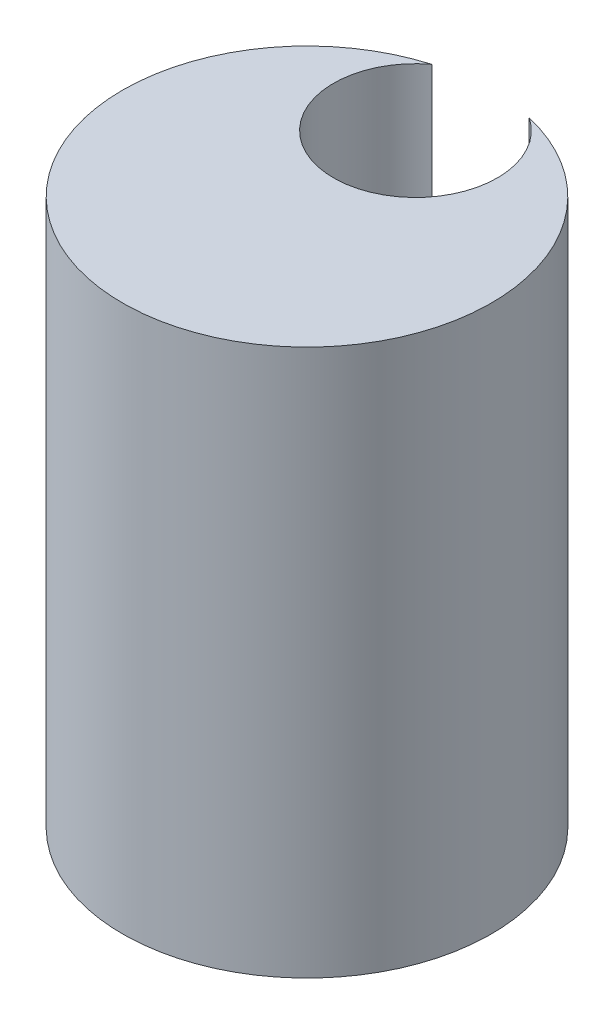
ISO-10303-21;
HEADER;
FILE_DESCRIPTION(('STEP AP214'),'2;1');
FILE_NAME('part.step','',(''),(''),'','','');
FILE_SCHEMA(('AUTOMOTIVE_DESIGN { 1 0 10303 214 1 1 1 1 }'));
ENDSEC;
DATA;
#1=APPLICATION_CONTEXT('core data for automotive mechanical design processes');
#2=APPLICATION_PROTOCOL_DEFINITION('international standard','automotive_design',2000,#1);
#3=PRODUCT_CONTEXT('',#1,'mechanical');
#4=PRODUCT('Part','Part','',(#3));
#5=PRODUCT_RELATED_PRODUCT_CATEGORY('part','',(#4));
#6=PRODUCT_DEFINITION_FORMATION('','',#4);
#7=PRODUCT_DEFINITION_CONTEXT('part definition',#1,'design');
#8=PRODUCT_DEFINITION('design','',#6,#7);
#9=PRODUCT_DEFINITION_SHAPE('','',#8);
#10=(LENGTH_UNIT() NAMED_UNIT(*) SI_UNIT(.MILLI.,.METRE.));
#11=(NAMED_UNIT(*) PLANE_ANGLE_UNIT() SI_UNIT($,.RADIAN.));
#12=(NAMED_UNIT(*) SI_UNIT($,.STERADIAN.) SOLID_ANGLE_UNIT());
#13=UNCERTAINTY_MEASURE_WITH_UNIT(LENGTH_MEASURE(1.E-05),#10,'distance_accuracy_value','');
#14=(GEOMETRIC_REPRESENTATION_CONTEXT(3) GLOBAL_UNCERTAINTY_ASSIGNED_CONTEXT((#13)) GLOBAL_UNIT_ASSIGNED_CONTEXT((#10,
#11,#12)) REPRESENTATION_CONTEXT('',''));
#15=CARTESIAN_POINT('',(0.,0.,0.));
#16=DIRECTION('',(0.,0.,1.));
#17=DIRECTION('',(1.,0.,0.));
#18=AXIS2_PLACEMENT_3D('',#15,#16,#17);
#19=CARTESIAN_POINT('',(0.,4.,0.));
#20=DIRECTION('',(0.,-1.,0.));
#21=DIRECTION('',(0.,0.,-1.));
#22=AXIS2_PLACEMENT_3D('',#19,#20,#21);
#23=CYLINDRICAL_SURFACE('',#22,1.35);
#24=CARTESIAN_POINT('',(0.,0.,0.));
#25=DIRECTION('',(0.,1.,0.));
#26=DIRECTION('',(0.,0.,1.));
#27=AXIS2_PLACEMENT_3D('',#24,#25,#26);
#28=CIRCLE('',#27,1.35);
#29=CARTESIAN_POINT('',(-0.381703830109852,0.,-1.29491396860157));
#30=VERTEX_POINT('',#29);
#31=CARTESIAN_POINT('',(0.313680612354569,0.,-1.31305158826029));
#32=VERTEX_POINT('',#31);
#33=EDGE_CURVE('E64',#30,#32,#28,.T.);
#34=ORIENTED_EDGE('',*,*,#33,.T.);
#35=DIRECTION('',(0.,1.,0.));
#36=VECTOR('',#35,1.);
#37=CARTESIAN_POINT('',(0.313680612354569,2.,-1.31305158826029));
#38=LINE('',#37,#36);
#39=CARTESIAN_POINT('',(0.313680612354569,4.,-1.31305158826029));
#40=VERTEX_POINT('',#39);
#41=EDGE_CURVE('E49',#32,#40,#38,.T.);
#42=ORIENTED_EDGE('',*,*,#41,.T.);
#43=CARTESIAN_POINT('',(0.,4.,0.));
#44=DIRECTION('',(0.,1.,0.));
#45=DIRECTION('',(0.,0.,1.));
#46=AXIS2_PLACEMENT_3D('',#43,#44,#45);
#47=CIRCLE('',#46,1.35);
#48=CARTESIAN_POINT('',(-0.381703830109852,4.,-1.29491396860157));
#49=VERTEX_POINT('',#48);
#50=EDGE_CURVE('E42',#49,#40,#47,.T.);
#51=ORIENTED_EDGE('',*,*,#50,.F.);
#52=DIRECTION('',(0.,1.,0.));
#53=VECTOR('',#52,1.);
#54=CARTESIAN_POINT('',(-0.381703830109852,2.,-1.29491396860157));
#55=LINE('',#54,#53);
#56=EDGE_CURVE('E53',#49,#30,#55,.F.);
#57=ORIENTED_EDGE('',*,*,#56,.T.);
#58=EDGE_LOOP('',(#34,#42,#51,#57));
#59=FACE_BOUND('',#58,.T.);
#60=ADVANCED_FACE('F35',(#59),#23,.T.);
#61=CARTESIAN_POINT('',(0.,4.,0.));
#62=DIRECTION('',(0.,1.,0.));
#63=DIRECTION('',(0.,0.,1.));
#64=AXIS2_PLACEMENT_3D('',#61,#62,#63);
#65=PLANE('',#64);
#66=CARTESIAN_POINT('',(-0.021263906420277,4.,-0.815244226580403));
#67=DIRECTION('',(0.,1.,0.));
#68=DIRECTION('',(0.,0.,1.));
#69=AXIS2_PLACEMENT_3D('',#66,#67,#68);
#70=CIRCLE('',#69,0.6);
#71=EDGE_CURVE('E66',#49,#40,#70,.T.);
#72=ORIENTED_EDGE('',*,*,#71,.F.);
#73=ORIENTED_EDGE('',*,*,#50,.T.);
#74=EDGE_LOOP('',(#72,#73));
#75=FACE_BOUND('',#74,.T.);
#76=ADVANCED_FACE('F73',(#75),#65,.T.);
#77=CARTESIAN_POINT('',(0.,0.,0.));
#78=DIRECTION('',(0.,1.,0.));
#79=DIRECTION('',(0.,0.,1.));
#80=AXIS2_PLACEMENT_3D('',#77,#78,#79);
#81=PLANE('',#80);
#82=ORIENTED_EDGE('',*,*,#33,.F.);
#83=CARTESIAN_POINT('',(-0.021263906420277,0.,-0.815244226580403));
#84=DIRECTION('',(0.,1.,0.));
#85=DIRECTION('',(0.,0.,1.));
#86=AXIS2_PLACEMENT_3D('',#83,#84,#85);
#87=CIRCLE('',#86,0.6);
#88=EDGE_CURVE('E11',#30,#32,#87,.T.);
#89=ORIENTED_EDGE('',*,*,#88,.T.);
#90=EDGE_LOOP('',(#82,#89));
#91=FACE_BOUND('',#90,.T.);
#92=ADVANCED_FACE('F68',(#91),#81,.F.);
#93=CARTESIAN_POINT('',(-0.021263906420277,0.,-0.815244226580403));
#94=DIRECTION('',(0.,1.,0.));
#95=DIRECTION('',(0.,0.,1.));
#96=AXIS2_PLACEMENT_3D('',#93,#94,#95);
#97=CYLINDRICAL_SURFACE('',#96,0.6);
#98=ORIENTED_EDGE('',*,*,#88,.F.);
#99=ORIENTED_EDGE('',*,*,#56,.F.);
#100=ORIENTED_EDGE('',*,*,#71,.T.);
#101=ORIENTED_EDGE('',*,*,#41,.F.);
#102=EDGE_LOOP('',(#98,#99,#100,#101));
#103=FACE_BOUND('',#102,.T.);
#104=ADVANCED_FACE('F58',(#103),#97,.F.);
#105=CLOSED_SHELL('',(#60,#76,#92,#104));
#106=MANIFOLD_SOLID_BREP('B2',#105);
#107=ADVANCED_BREP_SHAPE_REPRESENTATION('',(#18,#106),#14);
#108=SHAPE_DEFINITION_REPRESENTATION(#9,#107);
ENDSEC;
END-ISO-10303-21;
